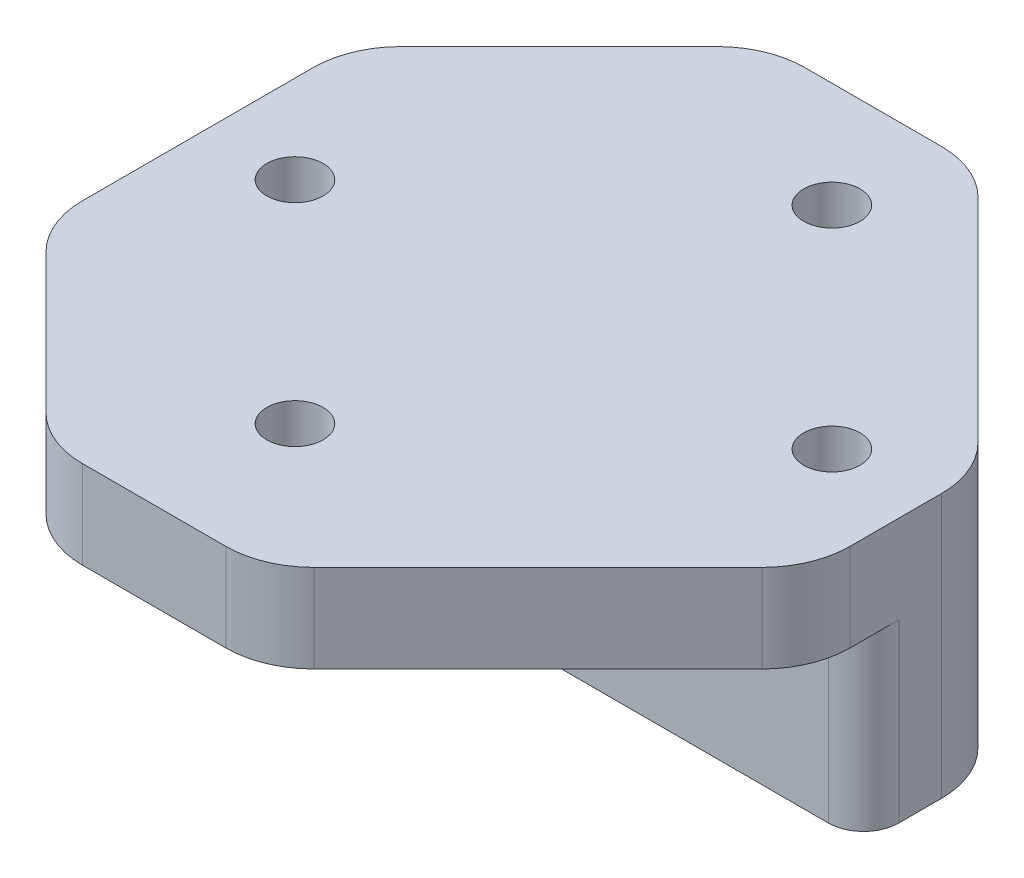
ISO-10303-21;
HEADER;
FILE_DESCRIPTION(('STEP AP214'),'2;1');
FILE_NAME('part.step','',(''),(''),'','','');
FILE_SCHEMA(('AUTOMOTIVE_DESIGN { 1 0 10303 214 1 1 1 1 }'));
ENDSEC;
DATA;
#1=APPLICATION_CONTEXT('core data for automotive mechanical design processes');
#2=APPLICATION_PROTOCOL_DEFINITION('international standard','automotive_design',2000,#1);
#3=PRODUCT_CONTEXT('',#1,'mechanical');
#4=PRODUCT('Part','Part','',(#3));
#5=PRODUCT_RELATED_PRODUCT_CATEGORY('part','',(#4));
#6=PRODUCT_DEFINITION_FORMATION('','',#4);
#7=PRODUCT_DEFINITION_CONTEXT('part definition',#1,'design');
#8=PRODUCT_DEFINITION('design','',#6,#7);
#9=PRODUCT_DEFINITION_SHAPE('','',#8);
#10=(LENGTH_UNIT() NAMED_UNIT(*) SI_UNIT(.MILLI.,.METRE.));
#11=(NAMED_UNIT(*) PLANE_ANGLE_UNIT() SI_UNIT($,.RADIAN.));
#12=(NAMED_UNIT(*) SI_UNIT($,.STERADIAN.) SOLID_ANGLE_UNIT());
#13=UNCERTAINTY_MEASURE_WITH_UNIT(LENGTH_MEASURE(1.E-05),#10,'distance_accuracy_value','');
#14=(GEOMETRIC_REPRESENTATION_CONTEXT(3) GLOBAL_UNCERTAINTY_ASSIGNED_CONTEXT((#13)) GLOBAL_UNIT_ASSIGNED_CONTEXT((#10,
#11,#12)) REPRESENTATION_CONTEXT('',''));
#15=CARTESIAN_POINT('',(0.,0.,0.));
#16=DIRECTION('',(0.,0.,1.));
#17=DIRECTION('',(1.,0.,0.));
#18=AXIS2_PLACEMENT_3D('',#15,#16,#17);
#19=CARTESIAN_POINT('',(-17.,5.,-32.));
#20=DIRECTION('',(0.,0.,1.));
#21=DIRECTION('',(1.,0.,0.));
#22=AXIS2_PLACEMENT_3D('',#19,#20,#21);
#23=PLANE('',#22);
#24=DIRECTION('',(1.,0.,0.));
#25=VECTOR('',#24,1.);
#26=CARTESIAN_POINT('',(0.,-5.5,-32.));
#27=LINE('',#26,#25);
#28=CARTESIAN_POINT('',(2.,-5.5,-32.));
#29=VERTEX_POINT('',#28);
#30=CARTESIAN_POINT('',(2.7,-5.5,-32.));
#31=VERTEX_POINT('',#30);
#32=EDGE_CURVE('E199',#29,#31,#27,.T.);
#33=ORIENTED_EDGE('',*,*,#32,.T.);
#34=DIRECTION('',(0.,1.,0.));
#35=VECTOR('',#34,1.);
#36=CARTESIAN_POINT('',(2.7,0.,-32.));
#37=LINE('',#36,#35);
#38=CARTESIAN_POINT('',(2.7,0.,-32.));
#39=VERTEX_POINT('',#38);
#40=EDGE_CURVE('E210',#31,#39,#37,.T.);
#41=ORIENTED_EDGE('',*,*,#40,.T.);
#42=DIRECTION('',(-1.,0.,0.));
#43=VECTOR('',#42,1.);
#44=CARTESIAN_POINT('',(-17.,0.,-32.));
#45=LINE('',#44,#43);
#46=CARTESIAN_POINT('',(-3.02893218813453,0.,-32.));
#47=VERTEX_POINT('',#46);
#48=EDGE_CURVE('E291',#39,#47,#45,.T.);
#49=ORIENTED_EDGE('',*,*,#48,.T.);
#50=DIRECTION('',(0.,1.,0.));
#51=VECTOR('',#50,1.);
#52=CARTESIAN_POINT('',(-3.02893218813453,5.,-32.));
#53=LINE('',#52,#51);
#54=CARTESIAN_POINT('',(-3.02893218813453,5.,-32.));
#55=VERTEX_POINT('',#54);
#56=EDGE_CURVE('E378',#47,#55,#53,.T.);
#57=ORIENTED_EDGE('',*,*,#56,.T.);
#58=DIRECTION('',(-1.,0.,0.));
#59=VECTOR('',#58,1.);
#60=CARTESIAN_POINT('',(-17.,5.,-32.));
#61=LINE('',#60,#59);
#62=CARTESIAN_POINT('',(4.72893218813452,5.,-32.));
#63=VERTEX_POINT('',#62);
#64=EDGE_CURVE('E294',#63,#55,#61,.T.);
#65=ORIENTED_EDGE('',*,*,#64,.F.);
#66=DIRECTION('',(0.,-1.,0.));
#67=VECTOR('',#66,1.);
#68=CARTESIAN_POINT('',(4.72893218813452,5.,-32.));
#69=LINE('',#68,#67);
#70=CARTESIAN_POINT('',(4.72893218813452,-10.,-32.));
#71=VERTEX_POINT('',#70);
#72=EDGE_CURVE('E375',#63,#71,#69,.T.);
#73=ORIENTED_EDGE('',*,*,#72,.T.);
#74=DIRECTION('',(1.,0.,0.));
#75=VECTOR('',#74,1.);
#76=CARTESIAN_POINT('',(0.,-10.,-32.));
#77=LINE('',#76,#75);
#78=CARTESIAN_POINT('',(2.,-10.,-32.));
#79=VERTEX_POINT('',#78);
#80=EDGE_CURVE('E262',#79,#71,#77,.T.);
#81=ORIENTED_EDGE('',*,*,#80,.F.);
#82=DIRECTION('',(0.,1.,0.));
#83=VECTOR('',#82,1.);
#84=CARTESIAN_POINT('',(2.,5.,-32.));
#85=LINE('',#84,#83);
#86=EDGE_CURVE('E218',#79,#29,#85,.T.);
#87=ORIENTED_EDGE('',*,*,#86,.T.);
#88=EDGE_LOOP('',(#33,#41,#49,#57,#65,#73,#81,#87));
#89=FACE_BOUND('',#88,.T.);
#90=ADVANCED_FACE('F35',(#89),#23,.F.);
#91=CARTESIAN_POINT('',(21.8,-10.,-10.5));
#92=DIRECTION('',(0.,0.,-1.));
#93=DIRECTION('',(-1.,0.,0.));
#94=AXIS2_PLACEMENT_3D('',#91,#92,#93);
#95=PLANE('',#94);
#96=DIRECTION('',(1.,0.,0.));
#97=VECTOR('',#96,1.);
#98=CARTESIAN_POINT('',(21.8,-5.5,-10.5));
#99=LINE('',#98,#97);
#100=CARTESIAN_POINT('',(2.,-5.5,-10.5));
#101=VERTEX_POINT('',#100);
#102=CARTESIAN_POINT('',(2.7,-5.5,-10.5));
#103=VERTEX_POINT('',#102);
#104=EDGE_CURVE('E202',#101,#103,#99,.T.);
#105=ORIENTED_EDGE('',*,*,#104,.F.);
#106=DIRECTION('',(0.,1.,0.));
#107=VECTOR('',#106,1.);
#108=CARTESIAN_POINT('',(2.,-10.,-10.5));
#109=LINE('',#108,#107);
#110=CARTESIAN_POINT('',(2.,-10.,-10.5));
#111=VERTEX_POINT('',#110);
#112=EDGE_CURVE('E272',#111,#101,#109,.T.);
#113=ORIENTED_EDGE('',*,*,#112,.F.);
#114=DIRECTION('',(-1.,0.,0.));
#115=VECTOR('',#114,1.);
#116=CARTESIAN_POINT('',(21.8,-10.,-10.5));
#117=LINE('',#116,#115);
#118=CARTESIAN_POINT('',(19.8,-10.,-10.5));
#119=VERTEX_POINT('',#118);
#120=EDGE_CURVE('E255',#119,#111,#117,.T.);
#121=ORIENTED_EDGE('',*,*,#120,.F.);
#122=DIRECTION('',(0.,1.,0.));
#123=VECTOR('',#122,1.);
#124=CARTESIAN_POINT('',(19.8,-10.,-10.5));
#125=LINE('',#124,#123);
#126=CARTESIAN_POINT('',(19.8,0.,-10.5));
#127=VERTEX_POINT('',#126);
#128=EDGE_CURVE('E397',#119,#127,#125,.T.);
#129=ORIENTED_EDGE('',*,*,#128,.T.);
#130=DIRECTION('',(-1.,0.,0.));
#131=VECTOR('',#130,1.);
#132=CARTESIAN_POINT('',(21.8,0.,-10.5));
#133=LINE('',#132,#131);
#134=CARTESIAN_POINT('',(2.7,0.,-10.5));
#135=VERTEX_POINT('',#134);
#136=EDGE_CURVE('E251',#127,#135,#133,.T.);
#137=ORIENTED_EDGE('',*,*,#136,.T.);
#138=DIRECTION('',(0.,1.,0.));
#139=VECTOR('',#138,1.);
#140=CARTESIAN_POINT('',(2.7,-10.,-10.5));
#141=LINE('',#140,#139);
#142=EDGE_CURVE('E12',#103,#135,#141,.T.);
#143=ORIENTED_EDGE('',*,*,#142,.F.);
#144=EDGE_LOOP('',(#105,#113,#121,#129,#137,#143));
#145=FACE_BOUND('',#144,.T.);
#146=ADVANCED_FACE('F415',(#145),#95,.F.);
#147=CARTESIAN_POINT('',(2.,-10.,-12.5));
#148=DIRECTION('',(0.,1.,0.));
#149=DIRECTION('',(0.,0.,1.));
#150=AXIS2_PLACEMENT_3D('',#147,#148,#149);
#151=CYLINDRICAL_SURFACE('',#150,2.);
#152=CARTESIAN_POINT('',(2.,-5.5,-12.5));
#153=DIRECTION('',(0.,1.,0.));
#154=DIRECTION('',(0.,0.,1.));
#155=AXIS2_PLACEMENT_3D('',#152,#153,#154);
#156=CIRCLE('',#155,2.);
#157=CARTESIAN_POINT('',(0.,-5.5,-12.5));
#158=VERTEX_POINT('',#157);
#159=EDGE_CURVE('E224',#158,#101,#156,.T.);
#160=ORIENTED_EDGE('',*,*,#159,.F.);
#161=DIRECTION('',(0.,1.,0.));
#162=VECTOR('',#161,1.);
#163=CARTESIAN_POINT('',(0.,-10.,-12.5));
#164=LINE('',#163,#162);
#165=CARTESIAN_POINT('',(0.,-10.,-12.5));
#166=VERTEX_POINT('',#165);
#167=EDGE_CURVE('E267',#166,#158,#164,.T.);
#168=ORIENTED_EDGE('',*,*,#167,.F.);
#169=CARTESIAN_POINT('',(2.,-10.,-12.5));
#170=DIRECTION('',(0.,-1.,0.));
#171=DIRECTION('',(0.,0.,-1.));
#172=AXIS2_PLACEMENT_3D('',#169,#170,#171);
#173=CIRCLE('',#172,2.);
#174=EDGE_CURVE('E257',#111,#166,#173,.T.);
#175=ORIENTED_EDGE('',*,*,#174,.F.);
#176=ORIENTED_EDGE('',*,*,#112,.T.);
#177=EDGE_LOOP('',(#160,#168,#175,#176));
#178=FACE_BOUND('',#177,.T.);
#179=ADVANCED_FACE('F412',(#178),#151,.T.);
#180=CARTESIAN_POINT('',(0.,-10.,-12.5));
#181=DIRECTION('',(1.,0.,0.));
#182=DIRECTION('',(0.,0.,-1.));
#183=AXIS2_PLACEMENT_3D('',#180,#181,#182);
#184=PLANE('',#183);
#185=DIRECTION('',(0.,0.,-1.));
#186=VECTOR('',#185,1.);
#187=CARTESIAN_POINT('',(0.,-5.5,8.));
#188=LINE('',#187,#186);
#189=CARTESIAN_POINT('',(0.,-5.5,-30.));
#190=VERTEX_POINT('',#189);
#191=EDGE_CURVE('E205',#158,#190,#188,.T.);
#192=ORIENTED_EDGE('',*,*,#191,.T.);
#193=DIRECTION('',(0.,1.,0.));
#194=VECTOR('',#193,1.);
#195=CARTESIAN_POINT('',(0.,-10.,-30.));
#196=LINE('',#195,#194);
#197=CARTESIAN_POINT('',(0.,-10.,-30.));
#198=VERTEX_POINT('',#197);
#199=EDGE_CURVE('E391',#190,#198,#196,.F.);
#200=ORIENTED_EDGE('',*,*,#199,.T.);
#201=DIRECTION('',(0.,0.,-1.));
#202=VECTOR('',#201,1.);
#203=CARTESIAN_POINT('',(0.,-10.,-12.5));
#204=LINE('',#203,#202);
#205=EDGE_CURVE('E259',#166,#198,#204,.T.);
#206=ORIENTED_EDGE('',*,*,#205,.F.);
#207=ORIENTED_EDGE('',*,*,#167,.T.);
#208=EDGE_LOOP('',(#192,#200,#206,#207));
#209=FACE_BOUND('',#208,.T.);
#210=ADVANCED_FACE('F407',(#209),#184,.F.);
#211=CARTESIAN_POINT('',(2.,5.,-30.));
#212=DIRECTION('',(0.,1.,0.));
#213=DIRECTION('',(0.,0.,1.));
#214=AXIS2_PLACEMENT_3D('',#211,#212,#213);
#215=CYLINDRICAL_SURFACE('',#214,2.);
#216=ORIENTED_EDGE('',*,*,#199,.F.);
#217=CARTESIAN_POINT('',(2.,-5.5,-30.));
#218=DIRECTION('',(0.,1.,0.));
#219=DIRECTION('',(0.,0.,1.));
#220=AXIS2_PLACEMENT_3D('',#217,#218,#219);
#221=CIRCLE('',#220,2.);
#222=EDGE_CURVE('E43',#190,#29,#221,.F.);
#223=ORIENTED_EDGE('',*,*,#222,.T.);
#224=ORIENTED_EDGE('',*,*,#86,.F.);
#225=CARTESIAN_POINT('',(2.,-10.,-30.));
#226=DIRECTION('',(0.,-1.,0.));
#227=DIRECTION('',(0.,0.,-1.));
#228=AXIS2_PLACEMENT_3D('',#225,#226,#227);
#229=CIRCLE('',#228,2.);
#230=EDGE_CURVE('E395',#198,#79,#229,.T.);
#231=ORIENTED_EDGE('',*,*,#230,.F.);
#232=EDGE_LOOP('',(#216,#223,#224,#231));
#233=FACE_BOUND('',#232,.T.);
#234=ADVANCED_FACE('F403',(#233),#215,.T.);
#235=CARTESIAN_POINT('',(0.,5.,0.));
#236=DIRECTION('',(0.,-1.,0.));
#237=DIRECTION('',(0.,0.,-1.));
#238=AXIS2_PLACEMENT_3D('',#235,#236,#237);
#239=PLANE('',#238);
#240=CARTESIAN_POINT('',(16.5,5.,-14.));
#241=DIRECTION('',(0.,1.,0.));
#242=DIRECTION('',(0.,0.,1.));
#243=AXIS2_PLACEMENT_3D('',#240,#241,#242);
#244=CIRCLE('',#243,1.60000000000001);
#245=CARTESIAN_POINT('',(16.5,5.,-12.4));
#246=VERTEX_POINT('',#245);
#247=EDGE_CURVE('E275',#246,#246,#244,.T.);
#248=ORIENTED_EDGE('',*,*,#247,.F.);
#249=EDGE_LOOP('',(#248));
#250=FACE_BOUND('',#249,.T.);
#251=CARTESIAN_POINT('',(4.5,5.,-26.));
#252=DIRECTION('',(0.,1.,0.));
#253=DIRECTION('',(0.,0.,1.));
#254=AXIS2_PLACEMENT_3D('',#251,#252,#253);
#255=CIRCLE('',#254,1.6);
#256=CARTESIAN_POINT('',(4.5,5.,-24.4));
#257=VERTEX_POINT('',#256);
#258=EDGE_CURVE('E278',#257,#257,#255,.T.);
#259=ORIENTED_EDGE('',*,*,#258,.F.);
#260=EDGE_LOOP('',(#259));
#261=FACE_BOUND('',#260,.T.);
#262=CARTESIAN_POINT('',(-12.,5.,-12.));
#263=DIRECTION('',(0.,1.,0.));
#264=DIRECTION('',(0.,0.,1.));
#265=AXIS2_PLACEMENT_3D('',#262,#263,#264);
#266=CIRCLE('',#265,1.6);
#267=CARTESIAN_POINT('',(-12.,5.,-10.4));
#268=VERTEX_POINT('',#267);
#269=EDGE_CURVE('E282',#268,#268,#266,.T.);
#270=ORIENTED_EDGE('',*,*,#269,.F.);
#271=EDGE_LOOP('',(#270));
#272=FACE_BOUND('',#271,.T.);
#273=CARTESIAN_POINT('',(0.,5.,0.));
#274=DIRECTION('',(0.,1.,0.));
#275=DIRECTION('',(0.,0.,1.));
#276=AXIS2_PLACEMENT_3D('',#273,#274,#275);
#277=CIRCLE('',#276,1.6);
#278=CARTESIAN_POINT('',(0.,5.,1.6));
#279=VERTEX_POINT('',#278);
#280=EDGE_CURVE('E288',#279,#279,#277,.T.);
#281=ORIENTED_EDGE('',*,*,#280,.F.);
#282=EDGE_LOOP('',(#281));
#283=FACE_BOUND('',#282,.T.);
#284=DIRECTION('',(0.707106781186549,0.,-0.707106781186546));
#285=VECTOR('',#284,1.);
#286=CARTESIAN_POINT('',(6.14213562373095,5.,8.));
#287=LINE('',#286,#285);
#288=CARTESIAN_POINT('',(7.60660171779821,5.,6.53553390593274));
#289=VERTEX_POINT('',#288);
#290=CARTESIAN_POINT('',(20.3355339059327,5.,-6.19339828220174));
#291=VERTEX_POINT('',#290);
#292=EDGE_CURVE('E233',#289,#291,#287,.T.);
#293=ORIENTED_EDGE('',*,*,#292,.T.);
#294=CARTESIAN_POINT('',(16.8,5.,-9.72893218813448));
#295=DIRECTION('',(0.,-1.,0.));
#296=DIRECTION('',(0.,0.,-1.));
#297=AXIS2_PLACEMENT_3D('',#294,#295,#296);
#298=CIRCLE('',#297,5.);
#299=CARTESIAN_POINT('',(21.8,5.,-9.72893218813448));
#300=VERTEX_POINT('',#299);
#301=EDGE_CURVE('E335',#291,#300,#298,.F.);
#302=ORIENTED_EDGE('',*,*,#301,.T.);
#303=DIRECTION('',(0.,0.,-1.));
#304=VECTOR('',#303,1.);
#305=CARTESIAN_POINT('',(21.8,5.,-17.));
#306=LINE('',#305,#304);
#307=CARTESIAN_POINT('',(21.8,5.,-14.9289321881345));
#308=VERTEX_POINT('',#307);
#309=EDGE_CURVE('E303',#300,#308,#306,.T.);
#310=ORIENTED_EDGE('',*,*,#309,.T.);
#311=CARTESIAN_POINT('',(16.8,5.,-14.9289321881345));
#312=DIRECTION('',(0.,-1.,0.));
#313=DIRECTION('',(0.,0.,-1.));
#314=AXIS2_PLACEMENT_3D('',#311,#312,#313);
#315=CIRCLE('',#314,5.);
#316=CARTESIAN_POINT('',(20.3355339059327,5.,-18.4644660940673));
#317=VERTEX_POINT('',#316);
#318=EDGE_CURVE('E323',#308,#317,#315,.F.);
#319=ORIENTED_EDGE('',*,*,#318,.T.);
#320=DIRECTION('',(-0.707106781186548,0.,-0.707106781186547));
#321=VECTOR('',#320,1.);
#322=CARTESIAN_POINT('',(6.79999999999999,5.,-32.));
#323=LINE('',#322,#321);
#324=CARTESIAN_POINT('',(8.26446609406725,5.,-30.5355339059327));
#325=VERTEX_POINT('',#324);
#326=EDGE_CURVE('E306',#317,#325,#323,.T.);
#327=ORIENTED_EDGE('',*,*,#326,.T.);
#328=CARTESIAN_POINT('',(4.72893218813452,5.,-27.));
#329=DIRECTION('',(0.,-1.,0.));
#330=DIRECTION('',(0.,0.,-1.));
#331=AXIS2_PLACEMENT_3D('',#328,#329,#330);
#332=CIRCLE('',#331,5.);
#333=EDGE_CURVE('E321',#325,#63,#332,.F.);
#334=ORIENTED_EDGE('',*,*,#333,.T.);
#335=ORIENTED_EDGE('',*,*,#64,.T.);
#336=CARTESIAN_POINT('',(-3.02893218813453,5.,-27.));
#337=DIRECTION('',(0.,-1.,0.));
#338=DIRECTION('',(0.,0.,-1.));
#339=AXIS2_PLACEMENT_3D('',#336,#337,#338);
#340=CIRCLE('',#339,5.);
#341=CARTESIAN_POINT('',(-6.56446609406727,5.,-30.5355339059327));
#342=VERTEX_POINT('',#341);
#343=EDGE_CURVE('E325',#55,#342,#340,.F.);
#344=ORIENTED_EDGE('',*,*,#343,.T.);
#345=DIRECTION('',(-0.707106781186546,0.,0.707106781186549));
#346=VECTOR('',#345,1.);
#347=CARTESIAN_POINT('',(-5.10000000000001,5.,-32.));
#348=LINE('',#347,#346);
#349=CARTESIAN_POINT('',(-15.5355339059327,5.,-21.5644660940672));
#350=VERTEX_POINT('',#349);
#351=EDGE_CURVE('E227',#342,#350,#348,.T.);
#352=ORIENTED_EDGE('',*,*,#351,.T.);
#353=CARTESIAN_POINT('',(-12.,5.,-18.0289321881345));
#354=DIRECTION('',(0.,-1.,0.));
#355=DIRECTION('',(0.,0.,-1.));
#356=AXIS2_PLACEMENT_3D('',#353,#354,#355);
#357=CIRCLE('',#356,5.);
#358=CARTESIAN_POINT('',(-17.,5.,-18.0289321881345));
#359=VERTEX_POINT('',#358);
#360=EDGE_CURVE('E327',#350,#359,#357,.F.);
#361=ORIENTED_EDGE('',*,*,#360,.T.);
#362=DIRECTION('',(0.,0.,1.));
#363=VECTOR('',#362,1.);
#364=CARTESIAN_POINT('',(-17.,5.,8.));
#365=LINE('',#364,#363);
#366=CARTESIAN_POINT('',(-17.,5.,-4.92893218813449));
#367=VERTEX_POINT('',#366);
#368=EDGE_CURVE('E297',#359,#367,#365,.T.);
#369=ORIENTED_EDGE('',*,*,#368,.T.);
#370=CARTESIAN_POINT('',(-12.,5.,-4.92893218813449));
#371=DIRECTION('',(0.,-1.,0.));
#372=DIRECTION('',(0.,0.,-1.));
#373=AXIS2_PLACEMENT_3D('',#370,#371,#372);
#374=CIRCLE('',#373,5.);
#375=CARTESIAN_POINT('',(-15.5355339059327,5.,-1.39339828220174));
#376=VERTEX_POINT('',#375);
#377=EDGE_CURVE('E329',#367,#376,#374,.F.);
#378=ORIENTED_EDGE('',*,*,#377,.T.);
#379=DIRECTION('',(0.707106781186549,0.,0.707106781186546));
#380=VECTOR('',#379,1.);
#381=CARTESIAN_POINT('',(-17.,5.,-2.85786437626901));
#382=LINE('',#381,#380);
#383=CARTESIAN_POINT('',(-7.60660171779821,5.,6.53553390593274));
#384=VERTEX_POINT('',#383);
#385=EDGE_CURVE('E230',#376,#384,#382,.T.);
#386=ORIENTED_EDGE('',*,*,#385,.T.);
#387=CARTESIAN_POINT('',(-4.07106781186548,5.,3.));
#388=DIRECTION('',(0.,-1.,0.));
#389=DIRECTION('',(0.,0.,-1.));
#390=AXIS2_PLACEMENT_3D('',#387,#388,#389);
#391=CIRCLE('',#390,5.);
#392=CARTESIAN_POINT('',(-4.07106781186548,5.,8.));
#393=VERTEX_POINT('',#392);
#394=EDGE_CURVE('E331',#384,#393,#391,.F.);
#395=ORIENTED_EDGE('',*,*,#394,.T.);
#396=DIRECTION('',(1.,0.,0.));
#397=VECTOR('',#396,1.);
#398=CARTESIAN_POINT('',(21.8,5.,8.));
#399=LINE('',#398,#397);
#400=CARTESIAN_POINT('',(4.07106781186548,5.,8.));
#401=VERTEX_POINT('',#400);
#402=EDGE_CURVE('E300',#393,#401,#399,.T.);
#403=ORIENTED_EDGE('',*,*,#402,.T.);
#404=CARTESIAN_POINT('',(4.07106781186548,5.,3.));
#405=DIRECTION('',(0.,-1.,0.));
#406=DIRECTION('',(0.,0.,-1.));
#407=AXIS2_PLACEMENT_3D('',#404,#405,#406);
#408=CIRCLE('',#407,5.);
#409=EDGE_CURVE('E333',#401,#289,#408,.F.);
#410=ORIENTED_EDGE('',*,*,#409,.T.);
#411=EDGE_LOOP('',(#293,#302,#310,#319,#327,#334,#335,#344,#352,#361,#369,#378,#386,#395,#403,#410));
#412=FACE_BOUND('',#411,.T.);
#413=ADVANCED_FACE('F427',(#250,#261,#272,#283,#412),#239,.F.);
#414=CARTESIAN_POINT('',(0.,0.,0.));
#415=DIRECTION('',(0.,-1.,0.));
#416=DIRECTION('',(0.,0.,-1.));
#417=AXIS2_PLACEMENT_3D('',#414,#415,#416);
#418=PLANE('',#417);
#419=CARTESIAN_POINT('',(0.,0.,0.));
#420=DIRECTION('',(0.,1.,0.));
#421=DIRECTION('',(0.,0.,1.));
#422=AXIS2_PLACEMENT_3D('',#419,#420,#421);
#423=CIRCLE('',#422,1.6);
#424=CARTESIAN_POINT('',(0.,0.,1.6));
#425=VERTEX_POINT('',#424);
#426=EDGE_CURVE('E285',#425,#425,#423,.T.);
#427=ORIENTED_EDGE('',*,*,#426,.T.);
#428=EDGE_LOOP('',(#427));
#429=FACE_BOUND('',#428,.T.);
#430=CARTESIAN_POINT('',(4.07106781186548,0.,3.));
#431=DIRECTION('',(0.,-1.,0.));
#432=DIRECTION('',(0.,0.,-1.));
#433=AXIS2_PLACEMENT_3D('',#430,#431,#432);
#434=CIRCLE('',#433,5.);
#435=CARTESIAN_POINT('',(7.60660171779821,0.,6.53553390593274));
#436=VERTEX_POINT('',#435);
#437=CARTESIAN_POINT('',(4.07106781186548,0.,8.));
#438=VERTEX_POINT('',#437);
#439=EDGE_CURVE('E350',#436,#438,#434,.T.);
#440=ORIENTED_EDGE('',*,*,#439,.T.);
#441=DIRECTION('',(1.,0.,0.));
#442=VECTOR('',#441,1.);
#443=CARTESIAN_POINT('',(21.8,0.,8.));
#444=LINE('',#443,#442);
#445=CARTESIAN_POINT('',(-4.07106781186548,0.,8.));
#446=VERTEX_POINT('',#445);
#447=EDGE_CURVE('E314',#446,#438,#444,.T.);
#448=ORIENTED_EDGE('',*,*,#447,.F.);
#449=CARTESIAN_POINT('',(-4.07106781186548,0.,3.));
#450=DIRECTION('',(0.,-1.,0.));
#451=DIRECTION('',(0.,0.,-1.));
#452=AXIS2_PLACEMENT_3D('',#449,#450,#451);
#453=CIRCLE('',#452,5.);
#454=CARTESIAN_POINT('',(-7.6066017177982,0.,6.53553390593274));
#455=VERTEX_POINT('',#454);
#456=EDGE_CURVE('E348',#446,#455,#453,.T.);
#457=ORIENTED_EDGE('',*,*,#456,.T.);
#458=DIRECTION('',(-0.707106781186549,0.,-0.707106781186546));
#459=VECTOR('',#458,1.);
#460=CARTESIAN_POINT('',(-7.07106781186546,0.,7.07106781186549));
#461=LINE('',#460,#459);
#462=CARTESIAN_POINT('',(-15.5355339059327,0.,-1.39339828220174));
#463=VERTEX_POINT('',#462);
#464=EDGE_CURVE('E239',#455,#463,#461,.T.);
#465=ORIENTED_EDGE('',*,*,#464,.T.);
#466=CARTESIAN_POINT('',(-12.,0.,-4.92893218813449));
#467=DIRECTION('',(0.,-1.,0.));
#468=DIRECTION('',(0.,0.,-1.));
#469=AXIS2_PLACEMENT_3D('',#466,#467,#468);
#470=CIRCLE('',#469,5.);
#471=CARTESIAN_POINT('',(-17.,0.,-4.92893218813449));
#472=VERTEX_POINT('',#471);
#473=EDGE_CURVE('E346',#463,#472,#470,.T.);
#474=ORIENTED_EDGE('',*,*,#473,.T.);
#475=DIRECTION('',(0.,0.,1.));
#476=VECTOR('',#475,1.);
#477=CARTESIAN_POINT('',(-17.,0.,8.));
#478=LINE('',#477,#476);
#479=CARTESIAN_POINT('',(-17.,0.,-18.0289321881345));
#480=VERTEX_POINT('',#479);
#481=EDGE_CURVE('E311',#480,#472,#478,.T.);
#482=ORIENTED_EDGE('',*,*,#481,.F.);
#483=CARTESIAN_POINT('',(-12.,0.,-18.0289321881345));
#484=DIRECTION('',(0.,-1.,0.));
#485=DIRECTION('',(0.,0.,-1.));
#486=AXIS2_PLACEMENT_3D('',#483,#484,#485);
#487=CIRCLE('',#486,5.);
#488=CARTESIAN_POINT('',(-15.5355339059327,0.,-21.5644660940672));
#489=VERTEX_POINT('',#488);
#490=EDGE_CURVE('E344',#480,#489,#487,.T.);
#491=ORIENTED_EDGE('',*,*,#490,.T.);
#492=DIRECTION('',(0.707106781186546,0.,-0.707106781186549));
#493=VECTOR('',#492,1.);
#494=CARTESIAN_POINT('',(-18.55,0.,-18.5499999999999));
#495=LINE('',#494,#493);
#496=CARTESIAN_POINT('',(-6.56446609406727,0.,-30.5355339059327));
#497=VERTEX_POINT('',#496);
#498=EDGE_CURVE('E242',#489,#497,#495,.T.);
#499=ORIENTED_EDGE('',*,*,#498,.T.);
#500=CARTESIAN_POINT('',(-3.02893218813453,0.,-27.));
#501=DIRECTION('',(0.,-1.,0.));
#502=DIRECTION('',(0.,0.,-1.));
#503=AXIS2_PLACEMENT_3D('',#500,#501,#502);
#504=CIRCLE('',#503,5.);
#505=EDGE_CURVE('E341',#497,#47,#504,.T.);
#506=ORIENTED_EDGE('',*,*,#505,.T.);
#507=ORIENTED_EDGE('',*,*,#48,.F.);
#508=DIRECTION('',(0.,0.,-1.));
#509=VECTOR('',#508,1.);
#510=CARTESIAN_POINT('',(2.7,0.,8.));
#511=LINE('',#510,#509);
#512=EDGE_CURVE('E206',#135,#39,#511,.T.);
#513=ORIENTED_EDGE('',*,*,#512,.F.);
#514=ORIENTED_EDGE('',*,*,#136,.F.);
#515=CARTESIAN_POINT('',(19.8,0.,-12.5));
#516=DIRECTION('',(0.,-1.,0.));
#517=DIRECTION('',(0.,0.,-1.));
#518=AXIS2_PLACEMENT_3D('',#515,#516,#517);
#519=CIRCLE('',#518,2.);
#520=CARTESIAN_POINT('',(21.8,0.,-12.5));
#521=VERTEX_POINT('',#520);
#522=EDGE_CURVE('E57',#127,#521,#519,.F.);
#523=ORIENTED_EDGE('',*,*,#522,.T.);
#524=DIRECTION('',(0.,0.,-1.));
#525=VECTOR('',#524,1.);
#526=CARTESIAN_POINT('',(21.8,0.,-17.));
#527=LINE('',#526,#525);
#528=CARTESIAN_POINT('',(21.8,0.,-9.72893218813448));
#529=VERTEX_POINT('',#528);
#530=EDGE_CURVE('E50',#529,#521,#527,.T.);
#531=ORIENTED_EDGE('',*,*,#530,.F.);
#532=CARTESIAN_POINT('',(16.8,0.,-9.72893218813448));
#533=DIRECTION('',(0.,-1.,0.));
#534=DIRECTION('',(0.,0.,-1.));
#535=AXIS2_PLACEMENT_3D('',#532,#533,#534);
#536=CIRCLE('',#535,5.);
#537=CARTESIAN_POINT('',(20.3355339059327,0.,-6.19339828220174));
#538=VERTEX_POINT('',#537);
#539=EDGE_CURVE('E353',#529,#538,#536,.T.);
#540=ORIENTED_EDGE('',*,*,#539,.T.);
#541=DIRECTION('',(-0.707106781186549,0.,0.707106781186546));
#542=VECTOR('',#541,1.);
#543=CARTESIAN_POINT('',(7.07106781186546,0.,7.07106781186549));
#544=LINE('',#543,#542);
#545=EDGE_CURVE('E236',#538,#436,#544,.T.);
#546=ORIENTED_EDGE('',*,*,#545,.T.);
#547=EDGE_LOOP('',(#440,#448,#457,#465,#474,#482,#491,#499,#506,#507,#513,#514,#523,#531,#540,#546));
#548=FACE_BOUND('',#547,.T.);
#549=CARTESIAN_POINT('',(-12.,0.,-12.));
#550=DIRECTION('',(0.,1.,0.));
#551=DIRECTION('',(0.,0.,1.));
#552=AXIS2_PLACEMENT_3D('',#549,#550,#551);
#553=CIRCLE('',#552,1.6);
#554=CARTESIAN_POINT('',(-12.,0.,-10.4));
#555=VERTEX_POINT('',#554);
#556=EDGE_CURVE('E281',#555,#555,#553,.T.);
#557=ORIENTED_EDGE('',*,*,#556,.T.);
#558=EDGE_LOOP('',(#557));
#559=FACE_BOUND('',#558,.T.);
#560=ADVANCED_FACE('F419',(#429,#548,#559),#418,.T.);
#561=CARTESIAN_POINT('',(-17.,5.,8.));
#562=DIRECTION('',(1.,0.,0.));
#563=DIRECTION('',(0.,0.,-1.));
#564=AXIS2_PLACEMENT_3D('',#561,#562,#563);
#565=PLANE('',#564);
#566=ORIENTED_EDGE('',*,*,#481,.T.);
#567=DIRECTION('',(0.,1.,0.));
#568=VECTOR('',#567,1.);
#569=CARTESIAN_POINT('',(-17.,5.,-4.92893218813449));
#570=LINE('',#569,#568);
#571=EDGE_CURVE('E367',#472,#367,#570,.T.);
#572=ORIENTED_EDGE('',*,*,#571,.T.);
#573=ORIENTED_EDGE('',*,*,#368,.F.);
#574=DIRECTION('',(0.,1.,0.));
#575=VECTOR('',#574,1.);
#576=CARTESIAN_POINT('',(-17.,0.,-18.0289321881345));
#577=LINE('',#576,#575);
#578=EDGE_CURVE('E365',#359,#480,#577,.F.);
#579=ORIENTED_EDGE('',*,*,#578,.T.);
#580=EDGE_LOOP('',(#566,#572,#573,#579));
#581=FACE_BOUND('',#580,.T.);
#582=ADVANCED_FACE('F470',(#581),#565,.F.);
#583=CARTESIAN_POINT('',(21.8,5.,8.));
#584=DIRECTION('',(0.,0.,-1.));
#585=DIRECTION('',(-1.,0.,0.));
#586=AXIS2_PLACEMENT_3D('',#583,#584,#585);
#587=PLANE('',#586);
#588=ORIENTED_EDGE('',*,*,#447,.T.);
#589=DIRECTION('',(0.,1.,0.));
#590=VECTOR('',#589,1.);
#591=CARTESIAN_POINT('',(4.07106781186548,5.,8.));
#592=LINE('',#591,#590);
#593=EDGE_CURVE('E357',#438,#401,#592,.T.);
#594=ORIENTED_EDGE('',*,*,#593,.T.);
#595=ORIENTED_EDGE('',*,*,#402,.F.);
#596=DIRECTION('',(0.,1.,0.));
#597=VECTOR('',#596,1.);
#598=CARTESIAN_POINT('',(-4.07106781186547,0.,8.));
#599=LINE('',#598,#597);
#600=EDGE_CURVE('E355',#393,#446,#599,.F.);
#601=ORIENTED_EDGE('',*,*,#600,.T.);
#602=EDGE_LOOP('',(#588,#594,#595,#601));
#603=FACE_BOUND('',#602,.T.);
#604=ADVANCED_FACE('F459',(#603),#587,.F.);
#605=CARTESIAN_POINT('',(21.8,5.,-17.));
#606=DIRECTION('',(-1.,0.,0.));
#607=DIRECTION('',(0.,0.,1.));
#608=AXIS2_PLACEMENT_3D('',#605,#606,#607);
#609=PLANE('',#608);
#610=ORIENTED_EDGE('',*,*,#530,.T.);
#611=DIRECTION('',(0.,1.,0.));
#612=VECTOR('',#611,1.);
#613=CARTESIAN_POINT('',(21.8,5.,-12.5));
#614=LINE('',#613,#612);
#615=CARTESIAN_POINT('',(21.8,-10.,-12.5));
#616=VERTEX_POINT('',#615);
#617=EDGE_CURVE('E399',#521,#616,#614,.F.);
#618=ORIENTED_EDGE('',*,*,#617,.T.);
#619=DIRECTION('',(0.,0.,1.));
#620=VECTOR('',#619,1.);
#621=CARTESIAN_POINT('',(21.8,-10.,-17.));
#622=LINE('',#621,#620);
#623=CARTESIAN_POINT('',(21.8,-10.,-14.9289321881345));
#624=VERTEX_POINT('',#623);
#625=EDGE_CURVE('E252',#624,#616,#622,.T.);
#626=ORIENTED_EDGE('',*,*,#625,.F.);
#627=DIRECTION('',(0.,-1.,0.));
#628=VECTOR('',#627,1.);
#629=CARTESIAN_POINT('',(21.8,5.,-14.9289321881345));
#630=LINE('',#629,#628);
#631=EDGE_CURVE('E337',#624,#308,#630,.F.);
#632=ORIENTED_EDGE('',*,*,#631,.T.);
#633=ORIENTED_EDGE('',*,*,#309,.F.);
#634=DIRECTION('',(0.,1.,0.));
#635=VECTOR('',#634,1.);
#636=CARTESIAN_POINT('',(21.8,0.,-9.72893218813448));
#637=LINE('',#636,#635);
#638=EDGE_CURVE('E339',#300,#529,#637,.F.);
#639=ORIENTED_EDGE('',*,*,#638,.T.);
#640=EDGE_LOOP('',(#610,#618,#626,#632,#633,#639));
#641=FACE_BOUND('',#640,.T.);
#642=ADVANCED_FACE('F441',(#641),#609,.F.);
#643=CARTESIAN_POINT('',(6.79999999999999,5.,-32.));
#644=DIRECTION('',(-0.707106781186547,0.,0.707106781186548));
#645=DIRECTION('',(0.707106781186548,0.,0.707106781186547));
#646=AXIS2_PLACEMENT_3D('',#643,#644,#645);
#647=PLANE('',#646);
#648=ORIENTED_EDGE('',*,*,#326,.F.);
#649=DIRECTION('',(0.,-1.,0.));
#650=VECTOR('',#649,1.);
#651=CARTESIAN_POINT('',(20.3355339059327,5.,-18.4644660940673));
#652=LINE('',#651,#650);
#653=CARTESIAN_POINT('',(20.3355339059327,-10.,-18.4644660940673));
#654=VERTEX_POINT('',#653);
#655=EDGE_CURVE('E383',#317,#654,#652,.T.);
#656=ORIENTED_EDGE('',*,*,#655,.T.);
#657=DIRECTION('',(0.707106781186548,0.,0.707106781186547));
#658=VECTOR('',#657,1.);
#659=CARTESIAN_POINT('',(6.79999999999999,-10.,-32.));
#660=LINE('',#659,#658);
#661=CARTESIAN_POINT('',(8.26446609406725,-10.,-30.5355339059327));
#662=VERTEX_POINT('',#661);
#663=EDGE_CURVE('E264',#662,#654,#660,.T.);
#664=ORIENTED_EDGE('',*,*,#663,.F.);
#665=DIRECTION('',(0.,-1.,0.));
#666=VECTOR('',#665,1.);
#667=CARTESIAN_POINT('',(8.26446609406725,5.,-30.5355339059327));
#668=LINE('',#667,#666);
#669=EDGE_CURVE('E381',#662,#325,#668,.F.);
#670=ORIENTED_EDGE('',*,*,#669,.T.);
#671=EDGE_LOOP('',(#648,#656,#664,#670));
#672=FACE_BOUND('',#671,.T.);
#673=ADVANCED_FACE('F448',(#672),#647,.F.);
#674=CARTESIAN_POINT('',(0.,5.,0.));
#675=DIRECTION('',(0.,-1.,0.));
#676=DIRECTION('',(0.,0.,-1.));
#677=AXIS2_PLACEMENT_3D('',#674,#675,#676);
#678=CYLINDRICAL_SURFACE('',#677,1.6);
#679=ORIENTED_EDGE('',*,*,#280,.T.);
#680=EDGE_LOOP('',(#679));
#681=FACE_BOUND('',#680,.T.);
#682=ORIENTED_EDGE('',*,*,#426,.F.);
#683=EDGE_LOOP('',(#682));
#684=FACE_BOUND('',#683,.T.);
#685=ADVANCED_FACE('F450',(#681,#684),#678,.F.);
#686=CARTESIAN_POINT('',(-12.,5.,-12.));
#687=DIRECTION('',(0.,-1.,0.));
#688=DIRECTION('',(0.,0.,-1.));
#689=AXIS2_PLACEMENT_3D('',#686,#687,#688);
#690=CYLINDRICAL_SURFACE('',#689,1.6);
#691=ORIENTED_EDGE('',*,*,#269,.T.);
#692=EDGE_LOOP('',(#691));
#693=FACE_BOUND('',#692,.T.);
#694=ORIENTED_EDGE('',*,*,#556,.F.);
#695=EDGE_LOOP('',(#694));
#696=FACE_BOUND('',#695,.T.);
#697=ADVANCED_FACE('F456',(#693,#696),#690,.F.);
#698=CARTESIAN_POINT('',(4.5,5.,-26.));
#699=DIRECTION('',(0.,-1.,0.));
#700=DIRECTION('',(0.,0.,-1.));
#701=AXIS2_PLACEMENT_3D('',#698,#699,#700);
#702=CYLINDRICAL_SURFACE('',#701,1.6);
#703=ORIENTED_EDGE('',*,*,#258,.T.);
#704=EDGE_LOOP('',(#703));
#705=FACE_BOUND('',#704,.T.);
#706=CARTESIAN_POINT('',(4.5,-10.,-26.));
#707=DIRECTION('',(0.,-1.,0.));
#708=DIRECTION('',(0.,0.,-1.));
#709=AXIS2_PLACEMENT_3D('',#706,#707,#708);
#710=CIRCLE('',#709,1.6);
#711=CARTESIAN_POINT('',(4.5,-10.,-27.6));
#712=VERTEX_POINT('',#711);
#713=EDGE_CURVE('E248',#712,#712,#710,.T.);
#714=ORIENTED_EDGE('',*,*,#713,.T.);
#715=EDGE_LOOP('',(#714));
#716=FACE_BOUND('',#715,.T.);
#717=ADVANCED_FACE('F517',(#705,#716),#702,.F.);
#718=CARTESIAN_POINT('',(16.5,5.,-14.));
#719=DIRECTION('',(0.,-1.,0.));
#720=DIRECTION('',(0.,0.,-1.));
#721=AXIS2_PLACEMENT_3D('',#718,#719,#720);
#722=CYLINDRICAL_SURFACE('',#721,1.60000000000001);
#723=ORIENTED_EDGE('',*,*,#247,.T.);
#724=EDGE_LOOP('',(#723));
#725=FACE_BOUND('',#724,.T.);
#726=CARTESIAN_POINT('',(16.5,-10.,-14.));
#727=DIRECTION('',(0.,-1.,0.));
#728=DIRECTION('',(0.,0.,-1.));
#729=AXIS2_PLACEMENT_3D('',#726,#727,#728);
#730=CIRCLE('',#729,1.60000000000001);
#731=CARTESIAN_POINT('',(16.5,-10.,-15.6));
#732=VERTEX_POINT('',#731);
#733=EDGE_CURVE('E245',#732,#732,#730,.T.);
#734=ORIENTED_EDGE('',*,*,#733,.T.);
#735=EDGE_LOOP('',(#734));
#736=FACE_BOUND('',#735,.T.);
#737=ADVANCED_FACE('F514',(#725,#736),#722,.F.);
#738=CARTESIAN_POINT('',(2.,-10.,-12.5));
#739=DIRECTION('',(0.,-1.,0.));
#740=DIRECTION('',(0.,0.,-1.));
#741=AXIS2_PLACEMENT_3D('',#738,#739,#740);
#742=PLANE('',#741);
#743=ORIENTED_EDGE('',*,*,#713,.F.);
#744=EDGE_LOOP('',(#743));
#745=FACE_BOUND('',#744,.T.);
#746=ORIENTED_EDGE('',*,*,#205,.T.);
#747=ORIENTED_EDGE('',*,*,#230,.T.);
#748=ORIENTED_EDGE('',*,*,#80,.T.);
#749=CARTESIAN_POINT('',(4.72893218813452,-10.,-27.));
#750=DIRECTION('',(0.,-1.,0.));
#751=DIRECTION('',(0.,0.,-1.));
#752=AXIS2_PLACEMENT_3D('',#749,#750,#751);
#753=CIRCLE('',#752,5.);
#754=EDGE_CURVE('E386',#71,#662,#753,.T.);
#755=ORIENTED_EDGE('',*,*,#754,.T.);
#756=ORIENTED_EDGE('',*,*,#663,.T.);
#757=CARTESIAN_POINT('',(16.8,-10.,-14.9289321881345));
#758=DIRECTION('',(0.,-1.,0.));
#759=DIRECTION('',(0.,0.,-1.));
#760=AXIS2_PLACEMENT_3D('',#757,#758,#759);
#761=CIRCLE('',#760,5.);
#762=EDGE_CURVE('E388',#654,#624,#761,.T.);
#763=ORIENTED_EDGE('',*,*,#762,.T.);
#764=ORIENTED_EDGE('',*,*,#625,.T.);
#765=CARTESIAN_POINT('',(19.8,-10.,-12.5));
#766=DIRECTION('',(0.,-1.,0.));
#767=DIRECTION('',(0.,0.,-1.));
#768=AXIS2_PLACEMENT_3D('',#765,#766,#767);
#769=CIRCLE('',#768,2.);
#770=EDGE_CURVE('E393',#616,#119,#769,.T.);
#771=ORIENTED_EDGE('',*,*,#770,.T.);
#772=ORIENTED_EDGE('',*,*,#120,.T.);
#773=ORIENTED_EDGE('',*,*,#174,.T.);
#774=EDGE_LOOP('',(#746,#747,#748,#755,#756,#763,#764,#771,#772,#773));
#775=FACE_BOUND('',#774,.T.);
#776=ORIENTED_EDGE('',*,*,#733,.F.);
#777=EDGE_LOOP('',(#776));
#778=FACE_BOUND('',#777,.T.);
#779=ADVANCED_FACE('F436',(#745,#775,#778),#742,.T.);
#780=CARTESIAN_POINT('',(6.14213562373095,-10.,8.));
#781=DIRECTION('',(0.707106781186546,0.,0.707106781186549));
#782=DIRECTION('',(0.707106781186549,0.,-0.707106781186546));
#783=AXIS2_PLACEMENT_3D('',#780,#781,#782);
#784=PLANE('',#783);
#785=ORIENTED_EDGE('',*,*,#545,.F.);
#786=DIRECTION('',(0.,1.,0.));
#787=VECTOR('',#786,1.);
#788=CARTESIAN_POINT('',(20.3355339059327,5.,-6.19339828220174));
#789=LINE('',#788,#787);
#790=EDGE_CURVE('E318',#538,#291,#789,.T.);
#791=ORIENTED_EDGE('',*,*,#790,.T.);
#792=ORIENTED_EDGE('',*,*,#292,.F.);
#793=DIRECTION('',(0.,1.,0.));
#794=VECTOR('',#793,1.);
#795=CARTESIAN_POINT('',(7.60660171779821,0.,6.53553390593274));
#796=LINE('',#795,#794);
#797=EDGE_CURVE('E309',#289,#436,#796,.F.);
#798=ORIENTED_EDGE('',*,*,#797,.T.);
#799=EDGE_LOOP('',(#785,#791,#792,#798));
#800=FACE_BOUND('',#799,.T.);
#801=ADVANCED_FACE('F558',(#800),#784,.T.);
#802=CARTESIAN_POINT('',(-17.,-10.,-2.85786437626901));
#803=DIRECTION('',(-0.707106781186546,0.,0.707106781186549));
#804=DIRECTION('',(0.707106781186549,0.,0.707106781186546));
#805=AXIS2_PLACEMENT_3D('',#802,#803,#804);
#806=PLANE('',#805);
#807=ORIENTED_EDGE('',*,*,#464,.F.);
#808=DIRECTION('',(0.,1.,0.));
#809=VECTOR('',#808,1.);
#810=CARTESIAN_POINT('',(-7.60660171779821,5.,6.53553390593275));
#811=LINE('',#810,#809);
#812=EDGE_CURVE('E362',#455,#384,#811,.T.);
#813=ORIENTED_EDGE('',*,*,#812,.T.);
#814=ORIENTED_EDGE('',*,*,#385,.F.);
#815=DIRECTION('',(0.,1.,0.));
#816=VECTOR('',#815,1.);
#817=CARTESIAN_POINT('',(-15.5355339059327,0.,-1.39339828220174));
#818=LINE('',#817,#816);
#819=EDGE_CURVE('E360',#376,#463,#818,.F.);
#820=ORIENTED_EDGE('',*,*,#819,.T.);
#821=EDGE_LOOP('',(#807,#813,#814,#820));
#822=FACE_BOUND('',#821,.T.);
#823=ADVANCED_FACE('F546',(#822),#806,.T.);
#824=CARTESIAN_POINT('',(-5.10000000000001,-10.,-32.));
#825=DIRECTION('',(-0.707106781186549,0.,-0.707106781186546));
#826=DIRECTION('',(-0.707106781186546,0.,0.707106781186549));
#827=AXIS2_PLACEMENT_3D('',#824,#825,#826);
#828=PLANE('',#827);
#829=ORIENTED_EDGE('',*,*,#498,.F.);
#830=DIRECTION('',(0.,1.,0.));
#831=VECTOR('',#830,1.);
#832=CARTESIAN_POINT('',(-15.5355339059327,5.,-21.5644660940672));
#833=LINE('',#832,#831);
#834=EDGE_CURVE('E372',#489,#350,#833,.T.);
#835=ORIENTED_EDGE('',*,*,#834,.T.);
#836=ORIENTED_EDGE('',*,*,#351,.F.);
#837=DIRECTION('',(0.,1.,0.));
#838=VECTOR('',#837,1.);
#839=CARTESIAN_POINT('',(-6.56446609406727,0.,-30.5355339059327));
#840=LINE('',#839,#838);
#841=EDGE_CURVE('E370',#342,#497,#840,.F.);
#842=ORIENTED_EDGE('',*,*,#841,.T.);
#843=EDGE_LOOP('',(#829,#835,#836,#842));
#844=FACE_BOUND('',#843,.T.);
#845=ADVANCED_FACE('F476',(#844),#828,.T.);
#846=CARTESIAN_POINT('',(16.8,-10.,-9.72893218813448));
#847=DIRECTION('',(0.,-1.,0.));
#848=DIRECTION('',(0.,0.,-1.));
#849=AXIS2_PLACEMENT_3D('',#846,#847,#848);
#850=CYLINDRICAL_SURFACE('',#849,5.);
#851=ORIENTED_EDGE('',*,*,#539,.F.);
#852=ORIENTED_EDGE('',*,*,#638,.F.);
#853=ORIENTED_EDGE('',*,*,#301,.F.);
#854=ORIENTED_EDGE('',*,*,#790,.F.);
#855=EDGE_LOOP('',(#851,#852,#853,#854));
#856=FACE_BOUND('',#855,.T.);
#857=ADVANCED_FACE('F472',(#856),#850,.T.);
#858=CARTESIAN_POINT('',(4.07106781186548,5.,3.));
#859=DIRECTION('',(0.,-1.,0.));
#860=DIRECTION('',(0.,0.,-1.));
#861=AXIS2_PLACEMENT_3D('',#858,#859,#860);
#862=CYLINDRICAL_SURFACE('',#861,5.);
#863=ORIENTED_EDGE('',*,*,#439,.F.);
#864=ORIENTED_EDGE('',*,*,#797,.F.);
#865=ORIENTED_EDGE('',*,*,#409,.F.);
#866=ORIENTED_EDGE('',*,*,#593,.F.);
#867=EDGE_LOOP('',(#863,#864,#865,#866));
#868=FACE_BOUND('',#867,.T.);
#869=ADVANCED_FACE('F475',(#868),#862,.T.);
#870=CARTESIAN_POINT('',(-4.07106781186548,-10.,3.));
#871=DIRECTION('',(0.,-1.,0.));
#872=DIRECTION('',(0.,0.,-1.));
#873=AXIS2_PLACEMENT_3D('',#870,#871,#872);
#874=CYLINDRICAL_SURFACE('',#873,5.);
#875=ORIENTED_EDGE('',*,*,#456,.F.);
#876=ORIENTED_EDGE('',*,*,#600,.F.);
#877=ORIENTED_EDGE('',*,*,#394,.F.);
#878=ORIENTED_EDGE('',*,*,#812,.F.);
#879=EDGE_LOOP('',(#875,#876,#877,#878));
#880=FACE_BOUND('',#879,.T.);
#881=ADVANCED_FACE('F480',(#880),#874,.T.);
#882=CARTESIAN_POINT('',(-12.,5.,-4.92893218813449));
#883=DIRECTION('',(0.,-1.,0.));
#884=DIRECTION('',(0.,0.,-1.));
#885=AXIS2_PLACEMENT_3D('',#882,#883,#884);
#886=CYLINDRICAL_SURFACE('',#885,5.);
#887=ORIENTED_EDGE('',*,*,#473,.F.);
#888=ORIENTED_EDGE('',*,*,#819,.F.);
#889=ORIENTED_EDGE('',*,*,#377,.F.);
#890=ORIENTED_EDGE('',*,*,#571,.F.);
#891=EDGE_LOOP('',(#887,#888,#889,#890));
#892=FACE_BOUND('',#891,.T.);
#893=ADVANCED_FACE('F484',(#892),#886,.T.);
#894=CARTESIAN_POINT('',(-12.,-10.,-18.0289321881345));
#895=DIRECTION('',(0.,-1.,0.));
#896=DIRECTION('',(0.,0.,-1.));
#897=AXIS2_PLACEMENT_3D('',#894,#895,#896);
#898=CYLINDRICAL_SURFACE('',#897,5.);
#899=ORIENTED_EDGE('',*,*,#490,.F.);
#900=ORIENTED_EDGE('',*,*,#578,.F.);
#901=ORIENTED_EDGE('',*,*,#360,.F.);
#902=ORIENTED_EDGE('',*,*,#834,.F.);
#903=EDGE_LOOP('',(#899,#900,#901,#902));
#904=FACE_BOUND('',#903,.T.);
#905=ADVANCED_FACE('F488',(#904),#898,.T.);
#906=CARTESIAN_POINT('',(-3.02893218813453,5.,-27.));
#907=DIRECTION('',(0.,-1.,0.));
#908=DIRECTION('',(0.,0.,-1.));
#909=AXIS2_PLACEMENT_3D('',#906,#907,#908);
#910=CYLINDRICAL_SURFACE('',#909,5.);
#911=ORIENTED_EDGE('',*,*,#505,.F.);
#912=ORIENTED_EDGE('',*,*,#841,.F.);
#913=ORIENTED_EDGE('',*,*,#343,.F.);
#914=ORIENTED_EDGE('',*,*,#56,.F.);
#915=EDGE_LOOP('',(#911,#912,#913,#914));
#916=FACE_BOUND('',#915,.T.);
#917=ADVANCED_FACE('F492',(#916),#910,.T.);
#918=CARTESIAN_POINT('',(16.8,5.,-14.9289321881345));
#919=DIRECTION('',(0.,-1.,0.));
#920=DIRECTION('',(0.,0.,-1.));
#921=AXIS2_PLACEMENT_3D('',#918,#919,#920);
#922=CYLINDRICAL_SURFACE('',#921,5.);
#923=ORIENTED_EDGE('',*,*,#318,.F.);
#924=ORIENTED_EDGE('',*,*,#631,.F.);
#925=ORIENTED_EDGE('',*,*,#762,.F.);
#926=ORIENTED_EDGE('',*,*,#655,.F.);
#927=EDGE_LOOP('',(#923,#924,#925,#926));
#928=FACE_BOUND('',#927,.T.);
#929=ADVANCED_FACE('F446',(#928),#922,.T.);
#930=CARTESIAN_POINT('',(4.72893218813452,5.,-27.));
#931=DIRECTION('',(0.,-1.,0.));
#932=DIRECTION('',(0.,0.,-1.));
#933=AXIS2_PLACEMENT_3D('',#930,#931,#932);
#934=CYLINDRICAL_SURFACE('',#933,5.);
#935=ORIENTED_EDGE('',*,*,#333,.F.);
#936=ORIENTED_EDGE('',*,*,#669,.F.);
#937=ORIENTED_EDGE('',*,*,#754,.F.);
#938=ORIENTED_EDGE('',*,*,#72,.F.);
#939=EDGE_LOOP('',(#935,#936,#937,#938));
#940=FACE_BOUND('',#939,.T.);
#941=ADVANCED_FACE('F433',(#940),#934,.T.);
#942=CARTESIAN_POINT('',(19.8,-10.,-12.5));
#943=DIRECTION('',(0.,1.,0.));
#944=DIRECTION('',(0.,0.,1.));
#945=AXIS2_PLACEMENT_3D('',#942,#943,#944);
#946=CYLINDRICAL_SURFACE('',#945,2.);
#947=ORIENTED_EDGE('',*,*,#770,.F.);
#948=ORIENTED_EDGE('',*,*,#617,.F.);
#949=ORIENTED_EDGE('',*,*,#522,.F.);
#950=ORIENTED_EDGE('',*,*,#128,.F.);
#951=EDGE_LOOP('',(#947,#948,#949,#950));
#952=FACE_BOUND('',#951,.T.);
#953=ADVANCED_FACE('F37',(#952),#946,.T.);
#954=CARTESIAN_POINT('',(2.7,0.,8.));
#955=DIRECTION('',(-1.,0.,0.));
#956=DIRECTION('',(0.,0.,1.));
#957=AXIS2_PLACEMENT_3D('',#954,#955,#956);
#958=PLANE('',#957);
#959=ORIENTED_EDGE('',*,*,#142,.T.);
#960=ORIENTED_EDGE('',*,*,#512,.T.);
#961=ORIENTED_EDGE('',*,*,#40,.F.);
#962=DIRECTION('',(0.,0.,-1.));
#963=VECTOR('',#962,1.);
#964=CARTESIAN_POINT('',(2.7,-5.5,8.));
#965=LINE('',#964,#963);
#966=EDGE_CURVE('E195',#103,#31,#965,.T.);
#967=ORIENTED_EDGE('',*,*,#966,.F.);
#968=EDGE_LOOP('',(#959,#960,#961,#967));
#969=FACE_BOUND('',#968,.T.);
#970=ADVANCED_FACE('F211',(#969),#958,.T.);
#971=CARTESIAN_POINT('',(0.,-5.5,8.));
#972=DIRECTION('',(0.,1.,0.));
#973=DIRECTION('',(0.,0.,1.));
#974=AXIS2_PLACEMENT_3D('',#971,#972,#973);
#975=PLANE('',#974);
#976=ORIENTED_EDGE('',*,*,#104,.T.);
#977=ORIENTED_EDGE('',*,*,#966,.T.);
#978=ORIENTED_EDGE('',*,*,#32,.F.);
#979=ORIENTED_EDGE('',*,*,#222,.F.);
#980=ORIENTED_EDGE('',*,*,#191,.F.);
#981=ORIENTED_EDGE('',*,*,#159,.T.);
#982=EDGE_LOOP('',(#976,#977,#978,#979,#980,#981));
#983=FACE_BOUND('',#982,.T.);
#984=ADVANCED_FACE('F197',(#983),#975,.T.);
#985=CLOSED_SHELL('',(#90,#146,#179,#210,#234,#413,#560,#582,#604,#642,#673,#685,#697,#717,#737,
#779,#801,#823,#845,#857,#869,#881,#893,#905,#917,#929,#941,#953,#970,#984));
#986=MANIFOLD_SOLID_BREP('B2',#985);
#987=ADVANCED_BREP_SHAPE_REPRESENTATION('',(#18,#986),#14);
#988=SHAPE_DEFINITION_REPRESENTATION(#9,#987);
ENDSEC;
END-ISO-10303-21;
